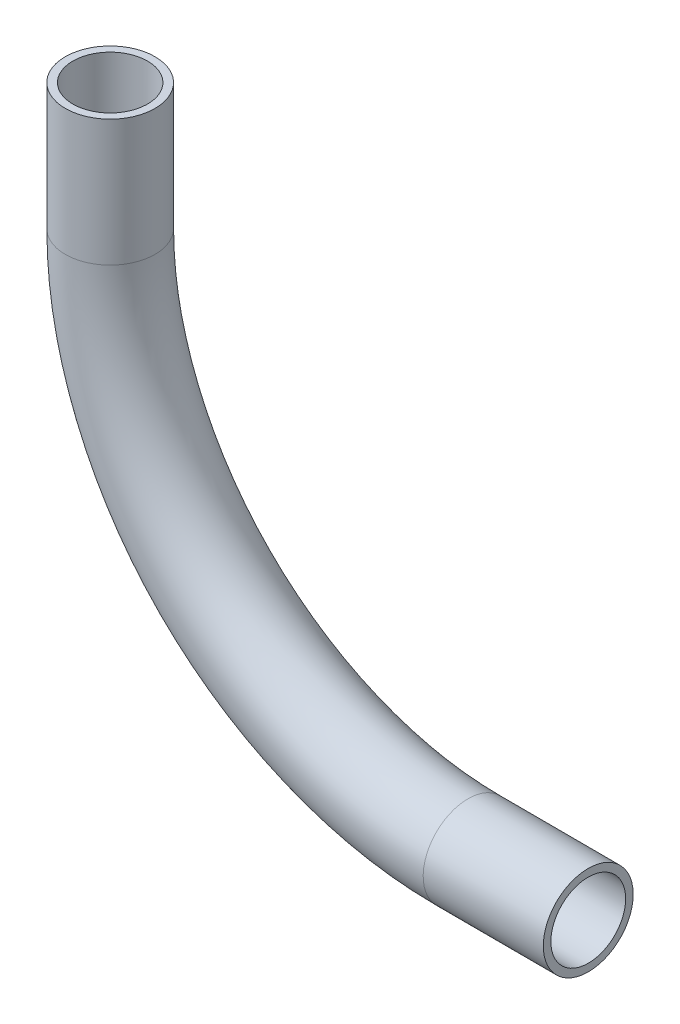
ISO-10303-21;
HEADER;
FILE_DESCRIPTION(('STEP AP214'),'2;1');
FILE_NAME('part.step','',(''),(''),'','','');
FILE_SCHEMA(('AUTOMOTIVE_DESIGN { 1 0 10303 214 1 1 1 1 }'));
ENDSEC;
DATA;
#1=APPLICATION_CONTEXT('core data for automotive mechanical design processes');
#2=APPLICATION_PROTOCOL_DEFINITION('international standard','automotive_design',2000,#1);
#3=PRODUCT_CONTEXT('',#1,'mechanical');
#4=PRODUCT('Part','Part','',(#3));
#5=PRODUCT_RELATED_PRODUCT_CATEGORY('part','',(#4));
#6=PRODUCT_DEFINITION_FORMATION('','',#4);
#7=PRODUCT_DEFINITION_CONTEXT('part definition',#1,'design');
#8=PRODUCT_DEFINITION('design','',#6,#7);
#9=PRODUCT_DEFINITION_SHAPE('','',#8);
#10=(LENGTH_UNIT() NAMED_UNIT(*) SI_UNIT(.MILLI.,.METRE.));
#11=(NAMED_UNIT(*) PLANE_ANGLE_UNIT() SI_UNIT($,.RADIAN.));
#12=(NAMED_UNIT(*) SI_UNIT($,.STERADIAN.) SOLID_ANGLE_UNIT());
#13=UNCERTAINTY_MEASURE_WITH_UNIT(LENGTH_MEASURE(1.E-05),#10,'distance_accuracy_value','');
#14=(GEOMETRIC_REPRESENTATION_CONTEXT(3) GLOBAL_UNCERTAINTY_ASSIGNED_CONTEXT((#13)) GLOBAL_UNIT_ASSIGNED_CONTEXT((#10,
#11,#12)) REPRESENTATION_CONTEXT('',''));
#15=CARTESIAN_POINT('',(0.,0.,0.));
#16=DIRECTION('',(0.,0.,1.));
#17=DIRECTION('',(1.,0.,0.));
#18=AXIS2_PLACEMENT_3D('',#15,#16,#17);
#19=CARTESIAN_POINT('',(44.5241187807455,-661.216394340681,354.927728694173));
#20=DIRECTION('',(0.,1.,0.));
#21=DIRECTION('',(0.,0.,1.));
#22=AXIS2_PLACEMENT_3D('',#19,#20,#21);
#23=CYLINDRICAL_SURFACE('',#22,5.2832);
#24=CARTESIAN_POINT('',(44.5241187807455,-643.315396514151,354.927728694173));
#25=DIRECTION('',(0.,-1.,0.));
#26=DIRECTION('',(0.,0.,-1.));
#27=AXIS2_PLACEMENT_3D('',#24,#25,#26);
#28=CIRCLE('',#27,5.2832);
#29=CARTESIAN_POINT('',(44.5241187807455,-643.315396514151,349.644528694173));
#30=VERTEX_POINT('',#29);
#31=EDGE_CURVE('E45',#30,#30,#28,.T.);
#32=ORIENTED_EDGE('',*,*,#31,.F.);
#33=EDGE_LOOP('',(#32));
#34=FACE_BOUND('',#33,.T.);
#35=CARTESIAN_POINT('',(44.5241187807457,-661.216394340681,354.927728694173));
#36=DIRECTION('',(0.,1.,0.));
#37=DIRECTION('',(0.,0.,1.));
#38=AXIS2_PLACEMENT_3D('',#35,#36,#37);
#39=CIRCLE('',#38,5.2832);
#40=CARTESIAN_POINT('',(39.2409333496049,-661.216394340681,354.915321430902));
#41=VERTEX_POINT('',#40);
#42=EDGE_CURVE('E56',#41,#41,#39,.T.);
#43=ORIENTED_EDGE('',*,*,#42,.F.);
#44=EDGE_LOOP('',(#43));
#45=FACE_BOUND('',#44,.T.);
#46=ADVANCED_FACE('F38',(#34,#45),#23,.F.);
#47=CARTESIAN_POINT('',(44.5241187807455,-661.216394340681,354.927728694173));
#48=DIRECTION('',(0.,1.,0.));
#49=DIRECTION('',(0.,0.,1.));
#50=AXIS2_PLACEMENT_3D('',#47,#48,#49);
#51=CYLINDRICAL_SURFACE('',#50,6.35);
#52=CARTESIAN_POINT('',(44.5241187807455,-643.315396514151,354.927728694173));
#53=DIRECTION('',(0.,-1.,0.));
#54=DIRECTION('',(0.,0.,-1.));
#55=AXIS2_PLACEMENT_3D('',#52,#53,#54);
#56=CIRCLE('',#55,6.35);
#57=CARTESIAN_POINT('',(44.5241187807455,-643.315396514151,348.577728694173));
#58=VERTEX_POINT('',#57);
#59=EDGE_CURVE('E49',#58,#58,#56,.T.);
#60=ORIENTED_EDGE('',*,*,#59,.T.);
#61=EDGE_LOOP('',(#60));
#62=FACE_BOUND('',#61,.T.);
#63=CARTESIAN_POINT('',(44.5241187807455,-661.216394340681,354.927728694173));
#64=DIRECTION('',(0.,-1.,0.));
#65=DIRECTION('',(0.,0.,-1.));
#66=AXIS2_PLACEMENT_3D('',#63,#64,#65);
#67=CIRCLE('',#66,6.35);
#68=CARTESIAN_POINT('',(38.1741362913938,-661.216394340681,354.912816118126));
#69=VERTEX_POINT('',#68);
#70=EDGE_CURVE('E11',#69,#69,#67,.T.);
#71=ORIENTED_EDGE('',*,*,#70,.F.);
#72=EDGE_LOOP('',(#71));
#73=FACE_BOUND('',#72,.T.);
#74=ADVANCED_FACE('F40',(#62,#73),#51,.T.);
#75=CARTESIAN_POINT('',(44.5241187807455,-643.315396514151,354.927728694173));
#76=DIRECTION('',(0.,-1.,0.));
#77=DIRECTION('',(0.,0.,-1.));
#78=AXIS2_PLACEMENT_3D('',#75,#76,#77);
#79=PLANE('',#78);
#80=ORIENTED_EDGE('',*,*,#31,.T.);
#81=EDGE_LOOP('',(#80));
#82=FACE_BOUND('',#81,.T.);
#83=ORIENTED_EDGE('',*,*,#59,.F.);
#84=EDGE_LOOP('',(#83));
#85=FACE_BOUND('',#84,.T.);
#86=ADVANCED_FACE('F90',(#82,#85),#79,.F.);
#87=CARTESIAN_POINT('',(95.3239786955607,-661.216394340681,355.047029302544));
#88=DIRECTION('',(0.00234843717266914,0.,-0.999997242417621));
#89=DIRECTION('',(-0.999997242417621,0.,-0.00234843717266914));
#90=AXIS2_PLACEMENT_3D('',#87,#88,#89);
#91=TOROIDAL_SURFACE('',#90,50.7999999999998,5.2832);
#92=CARTESIAN_POINT('',(95.3239786955607,-712.016394340681,355.047029302544));
#93=DIRECTION('',(-0.999997242417621,0.,-0.00234843717266865));
#94=DIRECTION('',(-0.00234843717266865,0.,0.999997242417621));
#95=AXIS2_PLACEMENT_3D('',#92,#93,#94);
#96=CIRCLE('',#95,5.2832);
#97=CARTESIAN_POINT('',(95.3239786955607,-717.299594340681,355.047029302544));
#98=VERTEX_POINT('',#97);
#99=EDGE_CURVE('E62',#98,#98,#96,.T.);
#100=CARTESIAN_POINT('',(95.3239786955607,-661.216394340681,355.047029302544));
#101=DIRECTION('',(0.00234843717266914,0.,-0.999997242417621));
#102=DIRECTION('',(-0.999997242417621,0.,-0.00234843717266914));
#103=AXIS2_PLACEMENT_3D('',#100,#101,#102);
#104=CIRCLE('',#103,56.0831999999998);
#105=EDGE_CURVE('',#98,#41,#104,.T.);
#106=ORIENTED_EDGE('',*,*,#99,.F.);
#107=ORIENTED_EDGE('',*,*,#42,.T.);
#108=ORIENTED_EDGE('',*,*,#105,.T.);
#109=ORIENTED_EDGE('',*,*,#105,.F.);
#110=EDGE_LOOP('',(#106,#108,#107,#109));
#111=FACE_BOUND('',#110,.T.);
#112=ADVANCED_FACE('F82',(#111),#91,.F.);
#113=CARTESIAN_POINT('',(95.3239786955607,-661.216394340681,355.047029302544));
#114=DIRECTION('',(0.00234843717266914,0.,-0.999997242417621));
#115=DIRECTION('',(-0.999997242417621,0.,-0.00234843717266914));
#116=AXIS2_PLACEMENT_3D('',#113,#114,#115);
#117=TOROIDAL_SURFACE('',#116,50.7999999999998,6.35);
#118=CARTESIAN_POINT('',(95.3239786955607,-712.016394340681,355.047029302544));
#119=DIRECTION('',(0.999997242417621,0.,0.0023484371726692));
#120=DIRECTION('',(0.0023484371726692,0.,-0.999997242417621));
#121=AXIS2_PLACEMENT_3D('',#118,#119,#120);
#122=CIRCLE('',#121,6.35);
#123=CARTESIAN_POINT('',(95.3239786955607,-718.366394340681,355.047029302544));
#124=VERTEX_POINT('',#123);
#125=EDGE_CURVE('E53',#124,#124,#122,.T.);
#126=CARTESIAN_POINT('',(95.3239786955607,-661.216394340681,355.047029302544));
#127=DIRECTION('',(0.00234843717266914,0.,-0.999997242417621));
#128=DIRECTION('',(-0.999997242417621,0.,-0.00234843717266914));
#129=AXIS2_PLACEMENT_3D('',#126,#127,#128);
#130=CIRCLE('',#129,57.1499999999998);
#131=EDGE_CURVE('',#124,#69,#130,.T.);
#132=ORIENTED_EDGE('',*,*,#125,.F.);
#133=ORIENTED_EDGE('',*,*,#70,.T.);
#134=ORIENTED_EDGE('',*,*,#131,.T.);
#135=ORIENTED_EDGE('',*,*,#131,.F.);
#136=EDGE_LOOP('',(#132,#134,#133,#135));
#137=FACE_BOUND('',#136,.T.);
#138=ADVANCED_FACE('F80',(#137),#117,.T.);
#139=CARTESIAN_POINT('',(112.372652062273,-712.016394340681,355.087067151231));
#140=DIRECTION('',(-0.999997242417621,0.,-0.00234843717267107));
#141=DIRECTION('',(-0.00234843717267107,0.,0.999997242417621));
#142=AXIS2_PLACEMENT_3D('',#139,#140,#141);
#143=CYLINDRICAL_SURFACE('',#142,5.2832);
#144=CARTESIAN_POINT('',(112.372652062273,-712.016394340681,355.087067151231));
#145=DIRECTION('',(0.999997242417621,0.,0.00234843717266865));
#146=DIRECTION('',(0.00234843069665968,-0.00234843717266859,-0.999994484842846));
#147=AXIS2_PLACEMENT_3D('',#144,#145,#146);
#148=CIRCLE('',#147,5.2832);
#149=CARTESIAN_POINT('',(112.385059291329,-712.028801603952,349.803896288909));
#150=VERTEX_POINT('',#149);
#151=EDGE_CURVE('E65',#150,#150,#148,.T.);
#152=ORIENTED_EDGE('',*,*,#151,.T.);
#153=EDGE_LOOP('',(#152));
#154=FACE_BOUND('',#153,.T.);
#155=ORIENTED_EDGE('',*,*,#99,.T.);
#156=EDGE_LOOP('',(#155));
#157=FACE_BOUND('',#156,.T.);
#158=ADVANCED_FACE('F76',(#154,#157),#143,.F.);
#159=CARTESIAN_POINT('',(112.372652062273,-712.016394340681,355.087067151231));
#160=DIRECTION('',(-0.999997242417621,0.,-0.00234843717267107));
#161=DIRECTION('',(-0.00234843717267107,0.,0.999997242417621));
#162=AXIS2_PLACEMENT_3D('',#159,#160,#161);
#163=CYLINDRICAL_SURFACE('',#162,6.35);
#164=CARTESIAN_POINT('',(112.372652062273,-712.016394340681,355.087067151231));
#165=DIRECTION('',(0.999997242417621,0.,0.00234843717266865));
#166=DIRECTION('',(0.00234843069665968,-0.00234843717266859,-0.999994484842846));
#167=AXIS2_PLACEMENT_3D('',#164,#165,#166);
#168=CIRCLE('',#167,6.35);
#169=CARTESIAN_POINT('',(112.387564597197,-712.031306916728,348.737102172479));
#170=VERTEX_POINT('',#169);
#171=EDGE_CURVE('E59',#170,#170,#168,.T.);
#172=ORIENTED_EDGE('',*,*,#171,.F.);
#173=EDGE_LOOP('',(#172));
#174=FACE_BOUND('',#173,.T.);
#175=ORIENTED_EDGE('',*,*,#125,.T.);
#176=EDGE_LOOP('',(#175));
#177=FACE_BOUND('',#176,.T.);
#178=ADVANCED_FACE('F73',(#174,#177),#163,.T.);
#179=CARTESIAN_POINT('',(112.372652062273,-712.016394340681,355.087067151231));
#180=DIRECTION('',(0.999997242417621,0.,0.00234843717266865));
#181=DIRECTION('',(0.00234843069665968,-0.00234843717266859,-0.999994484842846));
#182=AXIS2_PLACEMENT_3D('',#179,#180,#181);
#183=PLANE('',#182);
#184=ORIENTED_EDGE('',*,*,#151,.F.);
#185=EDGE_LOOP('',(#184));
#186=FACE_BOUND('',#185,.T.);
#187=ORIENTED_EDGE('',*,*,#171,.T.);
#188=EDGE_LOOP('',(#187));
#189=FACE_BOUND('',#188,.T.);
#190=ADVANCED_FACE('F71',(#186,#189),#183,.T.);
#191=CLOSED_SHELL('',(#46,#74,#86,#112,#138,#158,#178,#190));
#192=MANIFOLD_SOLID_BREP('B2',#191);
#193=ADVANCED_BREP_SHAPE_REPRESENTATION('',(#18,#192),#14);
#194=SHAPE_DEFINITION_REPRESENTATION(#9,#193);
ENDSEC;
END-ISO-10303-21;
